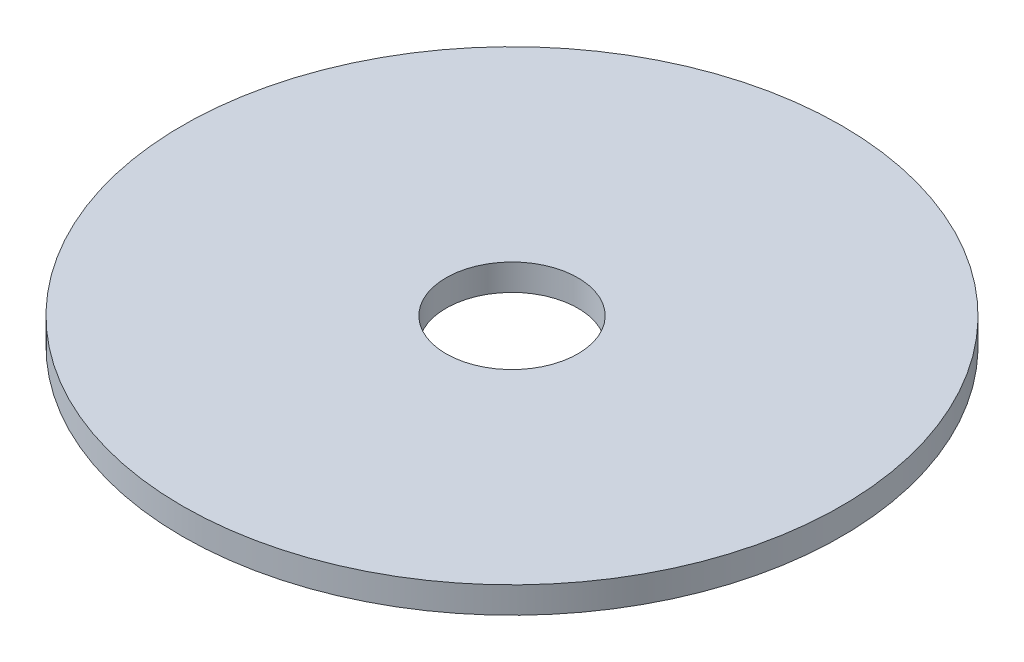
ISO-10303-21;
HEADER;
FILE_DESCRIPTION(('STEP AP214'),'2;1');
FILE_NAME('part.step','',(''),(''),'','','');
FILE_SCHEMA(('AUTOMOTIVE_DESIGN { 1 0 10303 214 1 1 1 1 }'));
ENDSEC;
DATA;
#1=APPLICATION_CONTEXT('core data for automotive mechanical design processes');
#2=APPLICATION_PROTOCOL_DEFINITION('international standard','automotive_design',2000,#1);
#3=PRODUCT_CONTEXT('',#1,'mechanical');
#4=PRODUCT('Part','Part','',(#3));
#5=PRODUCT_RELATED_PRODUCT_CATEGORY('part','',(#4));
#6=PRODUCT_DEFINITION_FORMATION('','',#4);
#7=PRODUCT_DEFINITION_CONTEXT('part definition',#1,'design');
#8=PRODUCT_DEFINITION('design','',#6,#7);
#9=PRODUCT_DEFINITION_SHAPE('','',#8);
#10=(LENGTH_UNIT() NAMED_UNIT(*) SI_UNIT(.MILLI.,.METRE.));
#11=(NAMED_UNIT(*) PLANE_ANGLE_UNIT() SI_UNIT($,.RADIAN.));
#12=(NAMED_UNIT(*) SI_UNIT($,.STERADIAN.) SOLID_ANGLE_UNIT());
#13=UNCERTAINTY_MEASURE_WITH_UNIT(LENGTH_MEASURE(1.E-05),#10,'distance_accuracy_value','');
#14=(GEOMETRIC_REPRESENTATION_CONTEXT(3) GLOBAL_UNCERTAINTY_ASSIGNED_CONTEXT((#13)) GLOBAL_UNIT_ASSIGNED_CONTEXT((#10,
#11,#12)) REPRESENTATION_CONTEXT('',''));
#15=CARTESIAN_POINT('',(0.,0.,0.));
#16=DIRECTION('',(0.,0.,1.));
#17=DIRECTION('',(1.,0.,0.));
#18=AXIS2_PLACEMENT_3D('',#15,#16,#17);
#19=CARTESIAN_POINT('',(0.,-2.,0.));
#20=DIRECTION('',(0.,1.,0.));
#21=DIRECTION('',(0.,0.,1.));
#22=AXIS2_PLACEMENT_3D('',#19,#20,#21);
#23=CYLINDRICAL_SURFACE('',#22,25.);
#24=CARTESIAN_POINT('',(0.,-2.,0.));
#25=DIRECTION('',(0.,1.,0.));
#26=DIRECTION('',(0.,0.,1.));
#27=AXIS2_PLACEMENT_3D('',#24,#25,#26);
#28=CIRCLE('',#27,25.);
#29=CARTESIAN_POINT('',(0.,-2.,25.));
#30=VERTEX_POINT('',#29);
#31=EDGE_CURVE('E10',#30,#30,#28,.T.);
#32=ORIENTED_EDGE('',*,*,#31,.T.);
#33=EDGE_LOOP('',(#32));
#34=FACE_BOUND('',#33,.T.);
#35=CARTESIAN_POINT('',(0.,0.,0.));
#36=DIRECTION('',(0.,1.,0.));
#37=DIRECTION('',(0.,0.,1.));
#38=AXIS2_PLACEMENT_3D('',#35,#36,#37);
#39=CIRCLE('',#38,25.);
#40=CARTESIAN_POINT('',(0.,0.,25.));
#41=VERTEX_POINT('',#40);
#42=EDGE_CURVE('E37',#41,#41,#39,.T.);
#43=ORIENTED_EDGE('',*,*,#42,.F.);
#44=EDGE_LOOP('',(#43));
#45=FACE_BOUND('',#44,.T.);
#46=ADVANCED_FACE('F34',(#34,#45),#23,.T.);
#47=CARTESIAN_POINT('',(0.,-2.,0.));
#48=DIRECTION('',(0.,1.,0.));
#49=DIRECTION('',(0.,0.,1.));
#50=AXIS2_PLACEMENT_3D('',#47,#48,#49);
#51=PLANE('',#50);
#52=CARTESIAN_POINT('',(0.,-2.,0.));
#53=DIRECTION('',(0.,1.,0.));
#54=DIRECTION('',(0.,0.,1.));
#55=AXIS2_PLACEMENT_3D('',#52,#53,#54);
#56=CIRCLE('',#55,5.);
#57=CARTESIAN_POINT('',(0.,-2.,5.));
#58=VERTEX_POINT('',#57);
#59=EDGE_CURVE('E44',#58,#58,#56,.T.);
#60=ORIENTED_EDGE('',*,*,#59,.T.);
#61=EDGE_LOOP('',(#60));
#62=FACE_BOUND('',#61,.T.);
#63=ORIENTED_EDGE('',*,*,#31,.F.);
#64=EDGE_LOOP('',(#63));
#65=FACE_BOUND('',#64,.T.);
#66=ADVANCED_FACE('F52',(#62,#65),#51,.F.);
#67=CARTESIAN_POINT('',(0.,0.,0.));
#68=DIRECTION('',(0.,1.,0.));
#69=DIRECTION('',(0.,0.,1.));
#70=AXIS2_PLACEMENT_3D('',#67,#68,#69);
#71=PLANE('',#70);
#72=CARTESIAN_POINT('',(0.,0.,0.));
#73=DIRECTION('',(0.,1.,0.));
#74=DIRECTION('',(0.,0.,1.));
#75=AXIS2_PLACEMENT_3D('',#72,#73,#74);
#76=CIRCLE('',#75,5.);
#77=CARTESIAN_POINT('',(0.,0.,5.));
#78=VERTEX_POINT('',#77);
#79=EDGE_CURVE('E46',#78,#78,#76,.T.);
#80=ORIENTED_EDGE('',*,*,#79,.F.);
#81=EDGE_LOOP('',(#80));
#82=FACE_BOUND('',#81,.T.);
#83=ORIENTED_EDGE('',*,*,#42,.T.);
#84=EDGE_LOOP('',(#83));
#85=FACE_BOUND('',#84,.T.);
#86=ADVANCED_FACE('F58',(#82,#85),#71,.T.);
#87=CARTESIAN_POINT('',(0.,-2.,0.));
#88=DIRECTION('',(0.,1.,0.));
#89=DIRECTION('',(0.,0.,1.));
#90=AXIS2_PLACEMENT_3D('',#87,#88,#89);
#91=CYLINDRICAL_SURFACE('',#90,5.);
#92=ORIENTED_EDGE('',*,*,#59,.F.);
#93=EDGE_LOOP('',(#92));
#94=FACE_BOUND('',#93,.T.);
#95=ORIENTED_EDGE('',*,*,#79,.T.);
#96=EDGE_LOOP('',(#95));
#97=FACE_BOUND('',#96,.T.);
#98=ADVANCED_FACE('F55',(#94,#97),#91,.F.);
#99=CLOSED_SHELL('',(#46,#66,#86,#98));
#100=MANIFOLD_SOLID_BREP('B2',#99);
#101=ADVANCED_BREP_SHAPE_REPRESENTATION('',(#18,#100),#14);
#102=SHAPE_DEFINITION_REPRESENTATION(#9,#101);
ENDSEC;
END-ISO-10303-21;
